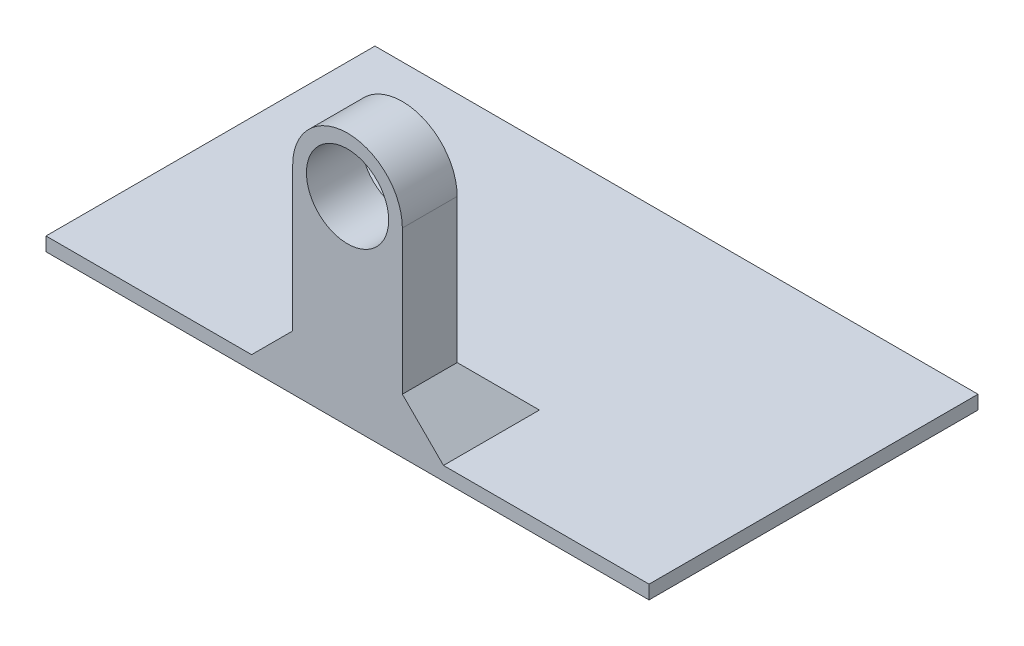
ISO-10303-21;
HEADER;
FILE_DESCRIPTION(('STEP AP214'),'2;1');
FILE_NAME('part.step','',(''),(''),'','','');
FILE_SCHEMA(('AUTOMOTIVE_DESIGN { 1 0 10303 214 1 1 1 1 }'));
ENDSEC;
DATA;
#1=APPLICATION_CONTEXT('core data for automotive mechanical design processes');
#2=APPLICATION_PROTOCOL_DEFINITION('international standard','automotive_design',2000,#1);
#3=PRODUCT_CONTEXT('',#1,'mechanical');
#4=PRODUCT('Part','Part','',(#3));
#5=PRODUCT_RELATED_PRODUCT_CATEGORY('part','',(#4));
#6=PRODUCT_DEFINITION_FORMATION('','',#4);
#7=PRODUCT_DEFINITION_CONTEXT('part definition',#1,'design');
#8=PRODUCT_DEFINITION('design','',#6,#7);
#9=PRODUCT_DEFINITION_SHAPE('','',#8);
#10=(LENGTH_UNIT() NAMED_UNIT(*) SI_UNIT(.MILLI.,.METRE.));
#11=(NAMED_UNIT(*) PLANE_ANGLE_UNIT() SI_UNIT($,.RADIAN.));
#12=(NAMED_UNIT(*) SI_UNIT($,.STERADIAN.) SOLID_ANGLE_UNIT());
#13=UNCERTAINTY_MEASURE_WITH_UNIT(LENGTH_MEASURE(1.E-05),#10,'distance_accuracy_value','');
#14=(GEOMETRIC_REPRESENTATION_CONTEXT(3) GLOBAL_UNCERTAINTY_ASSIGNED_CONTEXT((#13)) GLOBAL_UNIT_ASSIGNED_CONTEXT((#10,
#11,#12)) REPRESENTATION_CONTEXT('',''));
#15=CARTESIAN_POINT('',(0.,0.,0.));
#16=DIRECTION('',(0.,0.,1.));
#17=DIRECTION('',(1.,0.,0.));
#18=AXIS2_PLACEMENT_3D('',#15,#16,#17);
#19=CARTESIAN_POINT('',(-110.,5.,60.));
#20=DIRECTION('',(1.,0.,0.));
#21=DIRECTION('',(0.,0.,-1.));
#22=AXIS2_PLACEMENT_3D('',#19,#20,#21);
#23=PLANE('',#22);
#24=DIRECTION('',(0.,0.,1.));
#25=VECTOR('',#24,1.);
#26=CARTESIAN_POINT('',(-110.,0.,60.));
#27=LINE('',#26,#25);
#28=CARTESIAN_POINT('',(-110.,0.,-60.));
#29=VERTEX_POINT('',#28);
#30=CARTESIAN_POINT('',(-110.,0.,60.));
#31=VERTEX_POINT('',#30);
#32=EDGE_CURVE('E172',#29,#31,#27,.T.);
#33=ORIENTED_EDGE('',*,*,#32,.T.);
#34=DIRECTION('',(0.,-1.,0.));
#35=VECTOR('',#34,1.);
#36=CARTESIAN_POINT('',(-110.,5.,60.));
#37=LINE('',#36,#35);
#38=CARTESIAN_POINT('',(-110.,5.,60.));
#39=VERTEX_POINT('',#38);
#40=EDGE_CURVE('E213',#39,#31,#37,.T.);
#41=ORIENTED_EDGE('',*,*,#40,.F.);
#42=DIRECTION('',(0.,0.,1.));
#43=VECTOR('',#42,1.);
#44=CARTESIAN_POINT('',(-110.,5.,60.));
#45=LINE('',#44,#43);
#46=CARTESIAN_POINT('',(-110.,5.,-60.));
#47=VERTEX_POINT('',#46);
#48=EDGE_CURVE('E174',#47,#39,#45,.T.);
#49=ORIENTED_EDGE('',*,*,#48,.F.);
#50=DIRECTION('',(0.,-1.,0.));
#51=VECTOR('',#50,1.);
#52=CARTESIAN_POINT('',(-110.,5.,-60.));
#53=LINE('',#52,#51);
#54=EDGE_CURVE('E190',#47,#29,#53,.T.);
#55=ORIENTED_EDGE('',*,*,#54,.T.);
#56=EDGE_LOOP('',(#33,#41,#49,#55));
#57=FACE_BOUND('',#56,.T.);
#58=ADVANCED_FACE('F47',(#57),#23,.F.);
#59=CARTESIAN_POINT('',(110.,5.,60.));
#60=DIRECTION('',(0.,0.,-1.));
#61=DIRECTION('',(-1.,0.,0.));
#62=AXIS2_PLACEMENT_3D('',#59,#60,#61);
#63=PLANE('',#62);
#64=DIRECTION('',(1.,0.,0.));
#65=VECTOR('',#64,1.);
#66=CARTESIAN_POINT('',(110.,0.,60.));
#67=LINE('',#66,#65);
#68=CARTESIAN_POINT('',(110.,0.,60.));
#69=VERTEX_POINT('',#68);
#70=EDGE_CURVE('E194',#31,#69,#67,.T.);
#71=ORIENTED_EDGE('',*,*,#70,.T.);
#72=DIRECTION('',(0.,-1.,0.));
#73=VECTOR('',#72,1.);
#74=CARTESIAN_POINT('',(110.,5.,60.));
#75=LINE('',#74,#73);
#76=CARTESIAN_POINT('',(110.,5.,60.));
#77=VERTEX_POINT('',#76);
#78=EDGE_CURVE('E209',#77,#69,#75,.T.);
#79=ORIENTED_EDGE('',*,*,#78,.F.);
#80=DIRECTION('',(1.,0.,0.));
#81=VECTOR('',#80,1.);
#82=CARTESIAN_POINT('',(110.,5.,60.));
#83=LINE('',#82,#81);
#84=CARTESIAN_POINT('',(35.0000000000001,5.,60.));
#85=VERTEX_POINT('',#84);
#86=EDGE_CURVE('E178',#85,#77,#83,.T.);
#87=ORIENTED_EDGE('',*,*,#86,.F.);
#88=DIRECTION('',(0.707106781186551,-0.707106781186544,0.));
#89=VECTOR('',#88,1.);
#90=CARTESIAN_POINT('',(72.5000000000004,-32.4999999999999,60.));
#91=LINE('',#90,#89);
#92=CARTESIAN_POINT('',(20.,20.,60.));
#93=VERTEX_POINT('',#92);
#94=EDGE_CURVE('E11',#85,#93,#91,.F.);
#95=ORIENTED_EDGE('',*,*,#94,.T.);
#96=DIRECTION('',(0.,1.,0.));
#97=VECTOR('',#96,1.);
#98=CARTESIAN_POINT('',(20.,72.5,60.));
#99=LINE('',#98,#97);
#100=CARTESIAN_POINT('',(20.,72.5,60.));
#101=VERTEX_POINT('',#100);
#102=EDGE_CURVE('E155',#93,#101,#99,.T.);
#103=ORIENTED_EDGE('',*,*,#102,.T.);
#104=CARTESIAN_POINT('',(0.,72.5,60.));
#105=DIRECTION('',(0.,0.,1.));
#106=DIRECTION('',(1.,0.,0.));
#107=AXIS2_PLACEMENT_3D('',#104,#105,#106);
#108=CIRCLE('',#107,20.);
#109=CARTESIAN_POINT('',(-20.,72.5,60.));
#110=VERTEX_POINT('',#109);
#111=EDGE_CURVE('E165',#101,#110,#108,.T.);
#112=ORIENTED_EDGE('',*,*,#111,.T.);
#113=DIRECTION('',(0.,-1.,0.));
#114=VECTOR('',#113,1.);
#115=CARTESIAN_POINT('',(-20.,72.5,60.));
#116=LINE('',#115,#114);
#117=CARTESIAN_POINT('',(-20.,20.,60.));
#118=VERTEX_POINT('',#117);
#119=EDGE_CURVE('E134',#110,#118,#116,.T.);
#120=ORIENTED_EDGE('',*,*,#119,.T.);
#121=DIRECTION('',(0.707106781186551,0.707106781186544,0.));
#122=VECTOR('',#121,1.);
#123=CARTESIAN_POINT('',(37.5000000000006,77.5000000000001,60.));
#124=LINE('',#123,#122);
#125=CARTESIAN_POINT('',(-35.0000000000002,5.,60.));
#126=VERTEX_POINT('',#125);
#127=EDGE_CURVE('E58',#118,#126,#124,.F.);
#128=ORIENTED_EDGE('',*,*,#127,.T.);
#129=EDGE_CURVE('E180',#39,#126,#83,.T.);
#130=ORIENTED_EDGE('',*,*,#129,.F.);
#131=ORIENTED_EDGE('',*,*,#40,.T.);
#132=EDGE_LOOP('',(#71,#79,#87,#95,#103,#112,#120,#128,#130,#131));
#133=FACE_BOUND('',#132,.T.);
#134=CARTESIAN_POINT('',(0.,72.5,60.));
#135=DIRECTION('',(0.,0.,1.));
#136=DIRECTION('',(1.,0.,0.));
#137=AXIS2_PLACEMENT_3D('',#134,#135,#136);
#138=CIRCLE('',#137,15.);
#139=CARTESIAN_POINT('',(15.,72.5,60.));
#140=VERTEX_POINT('',#139);
#141=EDGE_CURVE('E160',#140,#140,#138,.T.);
#142=ORIENTED_EDGE('',*,*,#141,.F.);
#143=EDGE_LOOP('',(#142));
#144=FACE_BOUND('',#143,.T.);
#145=ADVANCED_FACE('F267',(#133,#144),#63,.F.);
#146=CARTESIAN_POINT('',(110.,5.,60.));
#147=DIRECTION('',(-1.,0.,0.));
#148=DIRECTION('',(0.,0.,1.));
#149=AXIS2_PLACEMENT_3D('',#146,#147,#148);
#150=PLANE('',#149);
#151=DIRECTION('',(0.,0.,-1.));
#152=VECTOR('',#151,1.);
#153=CARTESIAN_POINT('',(110.,0.,60.));
#154=LINE('',#153,#152);
#155=CARTESIAN_POINT('',(110.,0.,-60.));
#156=VERTEX_POINT('',#155);
#157=EDGE_CURVE('E197',#69,#156,#154,.T.);
#158=ORIENTED_EDGE('',*,*,#157,.T.);
#159=DIRECTION('',(0.,-1.,0.));
#160=VECTOR('',#159,1.);
#161=CARTESIAN_POINT('',(110.,5.,-60.));
#162=LINE('',#161,#160);
#163=CARTESIAN_POINT('',(110.,5.,-60.));
#164=VERTEX_POINT('',#163);
#165=EDGE_CURVE('E205',#164,#156,#162,.T.);
#166=ORIENTED_EDGE('',*,*,#165,.F.);
#167=DIRECTION('',(0.,0.,-1.));
#168=VECTOR('',#167,1.);
#169=CARTESIAN_POINT('',(110.,5.,60.));
#170=LINE('',#169,#168);
#171=EDGE_CURVE('E184',#77,#164,#170,.T.);
#172=ORIENTED_EDGE('',*,*,#171,.F.);
#173=ORIENTED_EDGE('',*,*,#78,.T.);
#174=EDGE_LOOP('',(#158,#166,#172,#173));
#175=FACE_BOUND('',#174,.T.);
#176=ADVANCED_FACE('F273',(#175),#150,.F.);
#177=CARTESIAN_POINT('',(110.,5.,-60.));
#178=DIRECTION('',(0.,0.,1.));
#179=DIRECTION('',(1.,0.,0.));
#180=AXIS2_PLACEMENT_3D('',#177,#178,#179);
#181=PLANE('',#180);
#182=DIRECTION('',(-1.,0.,0.));
#183=VECTOR('',#182,1.);
#184=CARTESIAN_POINT('',(110.,0.,-60.));
#185=LINE('',#184,#183);
#186=EDGE_CURVE('E179',#156,#29,#185,.T.);
#187=ORIENTED_EDGE('',*,*,#186,.T.);
#188=ORIENTED_EDGE('',*,*,#54,.F.);
#189=DIRECTION('',(-1.,0.,0.));
#190=VECTOR('',#189,1.);
#191=CARTESIAN_POINT('',(110.,5.,-60.));
#192=LINE('',#191,#190);
#193=EDGE_CURVE('E187',#164,#47,#192,.T.);
#194=ORIENTED_EDGE('',*,*,#193,.F.);
#195=ORIENTED_EDGE('',*,*,#165,.T.);
#196=EDGE_LOOP('',(#187,#188,#194,#195));
#197=FACE_BOUND('',#196,.T.);
#198=ADVANCED_FACE('F350',(#197),#181,.F.);
#199=CARTESIAN_POINT('',(0.,5.,0.));
#200=DIRECTION('',(0.,1.,0.));
#201=DIRECTION('',(0.,0.,1.));
#202=AXIS2_PLACEMENT_3D('',#199,#200,#201);
#203=PLANE('',#202);
#204=ORIENTED_EDGE('',*,*,#129,.T.);
#205=DIRECTION('',(0.,0.,-1.));
#206=VECTOR('',#205,1.);
#207=CARTESIAN_POINT('',(-35.0000000000002,5.,40.));
#208=LINE('',#207,#206);
#209=CARTESIAN_POINT('',(-35.0000000000002,5.,24.9999999999999));
#210=VERTEX_POINT('',#209);
#211=EDGE_CURVE('E226',#126,#210,#208,.T.);
#212=ORIENTED_EDGE('',*,*,#211,.T.);
#213=DIRECTION('',(1.,0.,0.));
#214=VECTOR('',#213,1.);
#215=CARTESIAN_POINT('',(0.,5.,24.9999999999999));
#216=LINE('',#215,#214);
#217=CARTESIAN_POINT('',(35.0000000000001,5.,24.9999999999999));
#218=VERTEX_POINT('',#217);
#219=EDGE_CURVE('E223',#210,#218,#216,.T.);
#220=ORIENTED_EDGE('',*,*,#219,.T.);
#221=DIRECTION('',(0.,0.,1.));
#222=VECTOR('',#221,1.);
#223=CARTESIAN_POINT('',(35.0000000000001,5.,60.));
#224=LINE('',#223,#222);
#225=EDGE_CURVE('E220',#218,#85,#224,.T.);
#226=ORIENTED_EDGE('',*,*,#225,.T.);
#227=ORIENTED_EDGE('',*,*,#86,.T.);
#228=ORIENTED_EDGE('',*,*,#171,.T.);
#229=ORIENTED_EDGE('',*,*,#193,.T.);
#230=ORIENTED_EDGE('',*,*,#48,.T.);
#231=EDGE_LOOP('',(#204,#212,#220,#226,#227,#228,#229,#230));
#232=FACE_BOUND('',#231,.T.);
#233=ADVANCED_FACE('F341',(#232),#203,.T.);
#234=CARTESIAN_POINT('',(0.,0.,0.));
#235=DIRECTION('',(0.,1.,0.));
#236=DIRECTION('',(0.,0.,1.));
#237=AXIS2_PLACEMENT_3D('',#234,#235,#236);
#238=PLANE('',#237);
#239=ORIENTED_EDGE('',*,*,#32,.F.);
#240=ORIENTED_EDGE('',*,*,#186,.F.);
#241=ORIENTED_EDGE('',*,*,#157,.F.);
#242=ORIENTED_EDGE('',*,*,#70,.F.);
#243=EDGE_LOOP('',(#239,#240,#241,#242));
#244=FACE_BOUND('',#243,.T.);
#245=ADVANCED_FACE('F332',(#244),#238,.F.);
#246=CARTESIAN_POINT('',(0.,72.5,40.));
#247=DIRECTION('',(0.,0.,1.));
#248=DIRECTION('',(1.,0.,0.));
#249=AXIS2_PLACEMENT_3D('',#246,#247,#248);
#250=CYLINDRICAL_SURFACE('',#249,20.);
#251=ORIENTED_EDGE('',*,*,#111,.F.);
#252=DIRECTION('',(0.,0.,1.));
#253=VECTOR('',#252,1.);
#254=CARTESIAN_POINT('',(20.,72.5,40.));
#255=LINE('',#254,#253);
#256=CARTESIAN_POINT('',(20.,72.5,40.));
#257=VERTEX_POINT('',#256);
#258=EDGE_CURVE('E140',#257,#101,#255,.T.);
#259=ORIENTED_EDGE('',*,*,#258,.F.);
#260=CARTESIAN_POINT('',(0.,72.5,40.));
#261=DIRECTION('',(0.,0.,1.));
#262=DIRECTION('',(1.,0.,0.));
#263=AXIS2_PLACEMENT_3D('',#260,#261,#262);
#264=CIRCLE('',#263,20.);
#265=CARTESIAN_POINT('',(-20.,72.5,40.));
#266=VERTEX_POINT('',#265);
#267=EDGE_CURVE('E146',#257,#266,#264,.T.);
#268=ORIENTED_EDGE('',*,*,#267,.T.);
#269=DIRECTION('',(0.,0.,1.));
#270=VECTOR('',#269,1.);
#271=CARTESIAN_POINT('',(-20.,72.5,40.));
#272=LINE('',#271,#270);
#273=EDGE_CURVE('E127',#266,#110,#272,.T.);
#274=ORIENTED_EDGE('',*,*,#273,.T.);
#275=EDGE_LOOP('',(#251,#259,#268,#274));
#276=FACE_BOUND('',#275,.T.);
#277=ADVANCED_FACE('F152',(#276),#250,.T.);
#278=CARTESIAN_POINT('',(20.,72.5,40.));
#279=DIRECTION('',(1.,0.,0.));
#280=DIRECTION('',(0.,1.,0.));
#281=AXIS2_PLACEMENT_3D('',#278,#279,#280);
#282=PLANE('',#281);
#283=ORIENTED_EDGE('',*,*,#102,.F.);
#284=DIRECTION('',(0.,0.,-1.));
#285=VECTOR('',#284,1.);
#286=CARTESIAN_POINT('',(20.,20.,40.));
#287=LINE('',#286,#285);
#288=CARTESIAN_POINT('',(20.,20.,40.));
#289=VERTEX_POINT('',#288);
#290=EDGE_CURVE('E71',#93,#289,#287,.T.);
#291=ORIENTED_EDGE('',*,*,#290,.T.);
#292=DIRECTION('',(0.,1.,0.));
#293=VECTOR('',#292,1.);
#294=CARTESIAN_POINT('',(20.,72.5,40.));
#295=LINE('',#294,#293);
#296=EDGE_CURVE('E141',#289,#257,#295,.T.);
#297=ORIENTED_EDGE('',*,*,#296,.T.);
#298=ORIENTED_EDGE('',*,*,#258,.T.);
#299=EDGE_LOOP('',(#283,#291,#297,#298));
#300=FACE_BOUND('',#299,.T.);
#301=ADVANCED_FACE('F318',(#300),#282,.T.);
#302=CARTESIAN_POINT('',(-20.,72.5,40.));
#303=DIRECTION('',(-1.,0.,0.));
#304=DIRECTION('',(0.,0.,1.));
#305=AXIS2_PLACEMENT_3D('',#302,#303,#304);
#306=PLANE('',#305);
#307=DIRECTION('',(0.,-1.,0.));
#308=VECTOR('',#307,1.);
#309=CARTESIAN_POINT('',(-20.,72.5,40.));
#310=LINE('',#309,#308);
#311=CARTESIAN_POINT('',(-20.,20.,40.));
#312=VERTEX_POINT('',#311);
#313=EDGE_CURVE('E131',#266,#312,#310,.T.);
#314=ORIENTED_EDGE('',*,*,#313,.T.);
#315=DIRECTION('',(0.,0.,1.));
#316=VECTOR('',#315,1.);
#317=CARTESIAN_POINT('',(-20.,20.,60.));
#318=LINE('',#317,#316);
#319=EDGE_CURVE('E217',#312,#118,#318,.T.);
#320=ORIENTED_EDGE('',*,*,#319,.T.);
#321=ORIENTED_EDGE('',*,*,#119,.F.);
#322=ORIENTED_EDGE('',*,*,#273,.F.);
#323=EDGE_LOOP('',(#314,#320,#321,#322));
#324=FACE_BOUND('',#323,.T.);
#325=ADVANCED_FACE('F129',(#324),#306,.T.);
#326=CARTESIAN_POINT('',(0.,72.5,40.));
#327=DIRECTION('',(0.,0.,1.));
#328=DIRECTION('',(1.,0.,0.));
#329=AXIS2_PLACEMENT_3D('',#326,#327,#328);
#330=PLANE('',#329);
#331=CARTESIAN_POINT('',(0.,72.5,40.));
#332=DIRECTION('',(0.,0.,1.));
#333=DIRECTION('',(1.,0.,0.));
#334=AXIS2_PLACEMENT_3D('',#331,#332,#333);
#335=CIRCLE('',#334,15.);
#336=CARTESIAN_POINT('',(15.,72.5,40.));
#337=VERTEX_POINT('',#336);
#338=EDGE_CURVE('E168',#337,#337,#335,.T.);
#339=ORIENTED_EDGE('',*,*,#338,.T.);
#340=EDGE_LOOP('',(#339));
#341=FACE_BOUND('',#340,.T.);
#342=ORIENTED_EDGE('',*,*,#296,.F.);
#343=DIRECTION('',(-1.,0.,0.));
#344=VECTOR('',#343,1.);
#345=CARTESIAN_POINT('',(0.,20.,40.));
#346=LINE('',#345,#344);
#347=EDGE_CURVE('E148',#289,#312,#346,.T.);
#348=ORIENTED_EDGE('',*,*,#347,.T.);
#349=ORIENTED_EDGE('',*,*,#313,.F.);
#350=ORIENTED_EDGE('',*,*,#267,.F.);
#351=EDGE_LOOP('',(#342,#348,#349,#350));
#352=FACE_BOUND('',#351,.T.);
#353=ADVANCED_FACE('F145',(#341,#352),#330,.F.);
#354=CARTESIAN_POINT('',(0.,72.5,40.));
#355=DIRECTION('',(0.,0.,1.));
#356=DIRECTION('',(1.,0.,0.));
#357=AXIS2_PLACEMENT_3D('',#354,#355,#356);
#358=CYLINDRICAL_SURFACE('',#357,15.);
#359=ORIENTED_EDGE('',*,*,#338,.F.);
#360=EDGE_LOOP('',(#359));
#361=FACE_BOUND('',#360,.T.);
#362=ORIENTED_EDGE('',*,*,#141,.T.);
#363=EDGE_LOOP('',(#362));
#364=FACE_BOUND('',#363,.T.);
#365=ADVANCED_FACE('F254',(#361,#364),#358,.F.);
#366=CARTESIAN_POINT('',(35.0000000000001,5.,0.));
#367=DIRECTION('',(0.707106781186544,0.707106781186551,0.));
#368=DIRECTION('',(0.,0.,-1.));
#369=AXIS2_PLACEMENT_3D('',#366,#367,#368);
#370=PLANE('',#369);
#371=ORIENTED_EDGE('',*,*,#94,.F.);
#372=ORIENTED_EDGE('',*,*,#225,.F.);
#373=DIRECTION('',(0.577350269189628,-0.577350269189622,-0.577350269189628));
#374=VECTOR('',#373,1.);
#375=CARTESIAN_POINT('',(43.3333333333334,-3.33333333333327,16.6666666666665));
#376=LINE('',#375,#374);
#377=EDGE_CURVE('E52',#289,#218,#376,.T.);
#378=ORIENTED_EDGE('',*,*,#377,.F.);
#379=ORIENTED_EDGE('',*,*,#290,.F.);
#380=EDGE_LOOP('',(#371,#372,#378,#379));
#381=FACE_BOUND('',#380,.T.);
#382=ADVANCED_FACE('F50',(#381),#370,.T.);
#383=CARTESIAN_POINT('',(0.,5.,24.9999999999999));
#384=DIRECTION('',(0.,-0.707106781186551,0.707106781186544));
#385=DIRECTION('',(1.,0.,0.));
#386=AXIS2_PLACEMENT_3D('',#383,#384,#385);
#387=PLANE('',#386);
#388=ORIENTED_EDGE('',*,*,#377,.T.);
#389=ORIENTED_EDGE('',*,*,#219,.F.);
#390=DIRECTION('',(-0.577350269189628,-0.577350269189622,-0.577350269189628));
#391=VECTOR('',#390,1.);
#392=CARTESIAN_POINT('',(-23.3333333333334,16.6666666666667,36.6666666666667));
#393=LINE('',#392,#391);
#394=EDGE_CURVE('E234',#312,#210,#393,.T.);
#395=ORIENTED_EDGE('',*,*,#394,.F.);
#396=ORIENTED_EDGE('',*,*,#347,.F.);
#397=EDGE_LOOP('',(#388,#389,#395,#396));
#398=FACE_BOUND('',#397,.T.);
#399=ADVANCED_FACE('F262',(#398),#387,.F.);
#400=CARTESIAN_POINT('',(-20.,20.,40.));
#401=DIRECTION('',(-0.707106781186544,0.707106781186551,0.));
#402=DIRECTION('',(0.,0.,-1.));
#403=AXIS2_PLACEMENT_3D('',#400,#401,#402);
#404=PLANE('',#403);
#405=ORIENTED_EDGE('',*,*,#394,.T.);
#406=ORIENTED_EDGE('',*,*,#211,.F.);
#407=ORIENTED_EDGE('',*,*,#127,.F.);
#408=ORIENTED_EDGE('',*,*,#319,.F.);
#409=EDGE_LOOP('',(#405,#406,#407,#408));
#410=FACE_BOUND('',#409,.T.);
#411=ADVANCED_FACE('F278',(#410),#404,.T.);
#412=CLOSED_SHELL('',(#58,#145,#176,#198,#233,#245,#277,#301,#325,#353,#365,#382,#399,#411));
#413=MANIFOLD_SOLID_BREP('B2',#412);
#414=ADVANCED_BREP_SHAPE_REPRESENTATION('',(#18,#413),#14);
#415=SHAPE_DEFINITION_REPRESENTATION(#9,#414);
ENDSEC;
END-ISO-10303-21;
